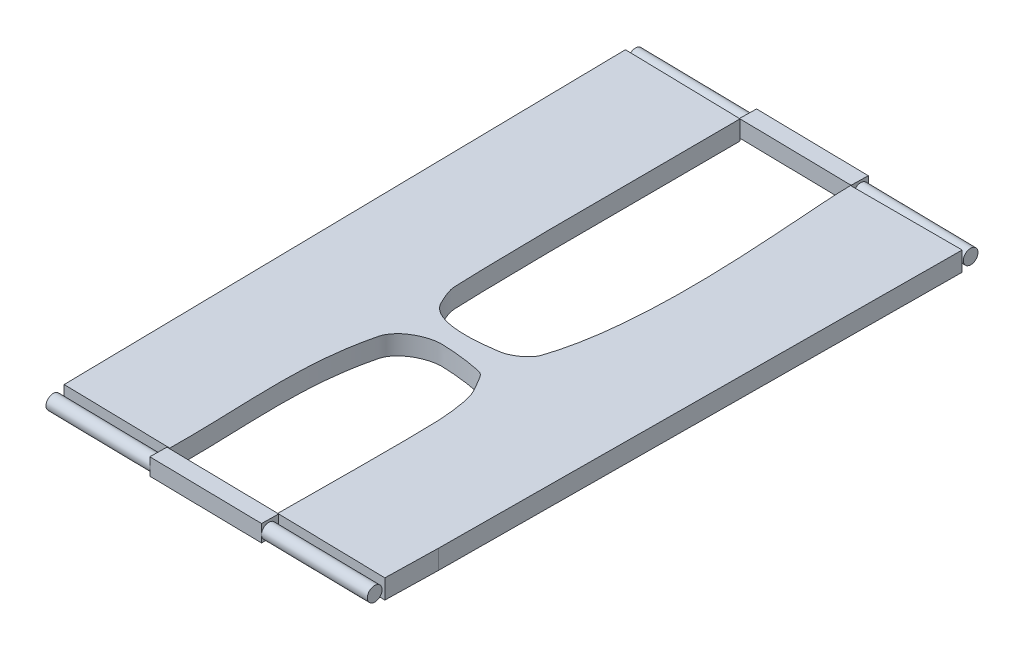
ISO-10303-21;
HEADER;
FILE_DESCRIPTION(('STEP AP214'),'2;1');
FILE_NAME('part.step','',(''),(''),'','','');
FILE_SCHEMA(('AUTOMOTIVE_DESIGN { 1 0 10303 214 1 1 1 1 }'));
ENDSEC;
DATA;
#1=APPLICATION_CONTEXT('core data for automotive mechanical design processes');
#2=APPLICATION_PROTOCOL_DEFINITION('international standard','automotive_design',2000,#1);
#3=PRODUCT_CONTEXT('',#1,'mechanical');
#4=PRODUCT('Part','Part','',(#3));
#5=PRODUCT_RELATED_PRODUCT_CATEGORY('part','',(#4));
#6=PRODUCT_DEFINITION_FORMATION('','',#4);
#7=PRODUCT_DEFINITION_CONTEXT('part definition',#1,'design');
#8=PRODUCT_DEFINITION('design','',#6,#7);
#9=PRODUCT_DEFINITION_SHAPE('','',#8);
#10=(LENGTH_UNIT() NAMED_UNIT(*) SI_UNIT(.MILLI.,.METRE.));
#11=(NAMED_UNIT(*) PLANE_ANGLE_UNIT() SI_UNIT($,.RADIAN.));
#12=(NAMED_UNIT(*) SI_UNIT($,.STERADIAN.) SOLID_ANGLE_UNIT());
#13=UNCERTAINTY_MEASURE_WITH_UNIT(LENGTH_MEASURE(1.E-05),#10,'distance_accuracy_value','');
#14=(GEOMETRIC_REPRESENTATION_CONTEXT(3) GLOBAL_UNCERTAINTY_ASSIGNED_CONTEXT((#13)) GLOBAL_UNIT_ASSIGNED_CONTEXT((#10,
#11,#12)) REPRESENTATION_CONTEXT('',''));
#15=CARTESIAN_POINT('',(0.,0.,0.));
#16=DIRECTION('',(0.,0.,1.));
#17=DIRECTION('',(1.,0.,0.));
#18=AXIS2_PLACEMENT_3D('',#15,#16,#17);
#19=CARTESIAN_POINT('',(16.938276071077,32.4664425061498,79.9782570236714));
#20=DIRECTION('',(0.999866385580923,0.,-0.0163465894100423));
#21=DIRECTION('',(-0.0163465894100423,0.,-0.999866385580923));
#22=AXIS2_PLACEMENT_3D('',#19,#20,#21);
#23=PLANE('',#22);
#24=DIRECTION('',(0.,1.,0.));
#25=VECTOR('',#24,1.);
#26=CARTESIAN_POINT('',(16.6869872427391,22.4664425061498,64.6077570236714));
#27=LINE('',#26,#25);
#28=CARTESIAN_POINT('',(16.6869872427391,31.4664425061498,64.6077570236714));
#29=VERTEX_POINT('',#28);
#30=CARTESIAN_POINT('',(16.6869872427391,32.4664425061498,64.6077570236714));
#31=VERTEX_POINT('',#30);
#32=EDGE_CURVE('P0_E214',#29,#31,#27,.T.);
#33=ORIENTED_EDGE('',*,*,#32,.T.);
#34=DIRECTION('',(0.0163465894100423,0.,0.999866385580923));
#35=VECTOR('',#34,1.);
#36=CARTESIAN_POINT('',(16.938276071077,32.4664425061498,79.9782570236714));
#37=LINE('',#36,#35);
#38=CARTESIAN_POINT('',(16.2029100181346,32.4664425061498,34.998366785361));
#39=VERTEX_POINT('',#38);
#40=EDGE_CURVE('P0_E154',#39,#31,#37,.T.);
#41=ORIENTED_EDGE('',*,*,#40,.F.);
#42=DIRECTION('',(0.,1.,0.));
#43=VECTOR('',#42,1.);
#44=CARTESIAN_POINT('',(16.2029100181346,22.4664425061498,34.998366785361));
#45=LINE('',#44,#43);
#46=CARTESIAN_POINT('',(16.2029100181346,31.4664425061498,34.998366785361));
#47=VERTEX_POINT('',#46);
#48=EDGE_CURVE('P0_E217',#47,#39,#45,.T.);
#49=ORIENTED_EDGE('',*,*,#48,.F.);
#50=DIRECTION('',(0.0163465894100423,0.,0.999866385580923));
#51=VECTOR('',#50,1.);
#52=CARTESIAN_POINT('',(16.938276071077,31.4664425061498,79.9782570236714));
#53=LINE('',#52,#51);
#54=EDGE_CURVE('P0_E275',#47,#29,#53,.T.);
#55=ORIENTED_EDGE('',*,*,#54,.T.);
#56=EDGE_LOOP('',(#33,#41,#49,#55));
#57=FACE_BOUND('',#56,.T.);
#58=ADVANCED_FACE('P0_F49',(#57),#23,.F.);
#59=CARTESIAN_POINT('',(34.015791695193,32.4664425061498,24.7044659959982));
#60=DIRECTION('',(-0.999975888217774,0.,-0.0069442770015123));
#61=DIRECTION('',(-0.00694427700151229,0.,0.999975888217774));
#62=AXIS2_PLACEMENT_3D('',#59,#60,#61);
#63=PLANE('',#62);
#64=DIRECTION('',(0.,1.,0.));
#65=VECTOR('',#64,1.);
#66=CARTESIAN_POINT('',(33.942462668181,22.4664425061498,35.2638458857188));
#67=LINE('',#66,#65);
#68=CARTESIAN_POINT('',(33.942462668181,31.4664425061498,35.2638458857188));
#69=VERTEX_POINT('',#68);
#70=CARTESIAN_POINT('',(33.942462668181,32.4664425061498,35.2638458857188));
#71=VERTEX_POINT('',#70);
#72=EDGE_CURVE('P0_E78',#69,#71,#67,.T.);
#73=ORIENTED_EDGE('',*,*,#72,.T.);
#74=DIRECTION('',(0.00694427700151229,0.,-0.999975888217774));
#75=VECTOR('',#74,1.);
#76=CARTESIAN_POINT('',(34.015791695193,32.4664425061498,24.7044659959982));
#77=LINE('',#76,#75);
#78=CARTESIAN_POINT('',(33.7550662658172,32.4664425061498,62.2489278261158));
#79=VERTEX_POINT('',#78);
#80=EDGE_CURVE('P0_E88',#79,#71,#77,.T.);
#81=ORIENTED_EDGE('',*,*,#80,.F.);
#82=DIRECTION('',(0.,-1.,0.));
#83=VECTOR('',#82,1.);
#84=CARTESIAN_POINT('',(33.7550662658172,32.4664425061498,62.2489278261158));
#85=LINE('',#84,#83);
#86=CARTESIAN_POINT('',(33.7550662658172,31.4664425061498,62.2489278261158));
#87=VERTEX_POINT('',#86);
#88=EDGE_CURVE('P0_E149',#79,#87,#85,.T.);
#89=ORIENTED_EDGE('',*,*,#88,.T.);
#90=DIRECTION('',(0.00694427700151229,0.,-0.999975888217774));
#91=VECTOR('',#90,1.);
#92=CARTESIAN_POINT('',(34.015791695193,31.4664425061498,24.7044659959982));
#93=LINE('',#92,#91);
#94=EDGE_CURVE('P0_E210',#87,#69,#93,.T.);
#95=ORIENTED_EDGE('',*,*,#94,.T.);
#96=EDGE_LOOP('',(#73,#81,#89,#95));
#97=FACE_BOUND('',#96,.T.);
#98=ADVANCED_FACE('P0_F199',(#97),#63,.F.);
#99=CARTESIAN_POINT('',(-8.90593602873058,32.4664425061498,21.706389720792));
#100=DIRECTION('',(0.,1.,0.));
#101=DIRECTION('',(0.,0.,1.));
#102=AXIS2_PLACEMENT_3D('',#99,#100,#101);
#103=PLANE('',#102);
#104=DIRECTION('',(1.,0.,0.));
#105=VECTOR('',#104,1.);
#106=CARTESIAN_POINT('',(28.1494695342371,32.4664425061498,35.2638458857188));
#107=LINE('',#106,#105);
#108=CARTESIAN_POINT('',(28.1494695342371,32.4664425061498,35.2638458857188));
#109=VERTEX_POINT('',#108);
#110=EDGE_CURVE('P0_E219',#109,#71,#107,.T.);
#111=ORIENTED_EDGE('',*,*,#110,.F.);
#112=CARTESIAN_POINT('',(22.2831473732812,32.4664425061498,35.1334831710309));
#113=CARTESIAN_POINT('',(22.3266016115105,32.4664425061498,40.0872663291714));
#114=CARTESIAN_POINT('',(22.2524903732256,32.4664425061498,45.0434764170883));
#115=CARTESIAN_POINT('',(22.4135100879691,32.4664425061498,49.9948326454524));
#116=CARTESIAN_POINT('',(22.4269092842241,32.4664425061498,50.4068579302927));
#117=CARTESIAN_POINT('',(22.6202375128934,32.4664425061498,50.7993756393648));
#118=CARTESIAN_POINT('',(22.8045982320329,32.4664425061498,51.1680970776436));
#119=CARTESIAN_POINT('',(23.3887553350724,32.4664425061498,52.3364112837227));
#120=CARTESIAN_POINT('',(25.9336122997829,32.4664425061498,51.9241513963951));
#121=CARTESIAN_POINT('',(26.5851169579822,32.4664425061498,51.8199106510832));
#122=CARTESIAN_POINT('',(26.9721703698342,32.4664425061498,51.7579821051869));
#123=CARTESIAN_POINT('',(27.6170817590701,32.4664425061498,51.3312705415775));
#124=CARTESIAN_POINT('',(27.7583813901734,32.4664425061498,50.9073716482678));
#125=CARTESIAN_POINT('',(29.340064443714,32.4664425061498,46.162322487646));
#126=CARTESIAN_POINT('',(28.1285361396691,32.4664425061498,37.6502528664753));
#127=CARTESIAN_POINT('',(28.1494695342371,32.4664425061498,35.2638458857188));
#128=B_SPLINE_CURVE_WITH_KNOTS('',3,(#112,#113,#114,#115,#116,#117,#118,#119,#120,#121,#122,
#123,#124,#125,#126,#127),.UNSPECIFIED.,.F.,.F.,(4,3,3,3,3,4),(0.,1.,2.,3.,4.,5.),.UNSPECIFIED.);
#129=CARTESIAN_POINT('',(22.2831473732812,32.4664425061498,35.1334831710309));
#130=VERTEX_POINT('',#129);
#131=EDGE_CURVE('P0_E162',#130,#109,#128,.T.);
#132=ORIENTED_EDGE('',*,*,#131,.F.);
#133=DIRECTION('',(0.99975317783161,0.,0.0222167372851469));
#134=VECTOR('',#133,1.);
#135=CARTESIAN_POINT('',(22.2831473732812,32.4664425061498,35.1334831710309));
#136=LINE('',#135,#134);
#137=EDGE_CURVE('P0_E52',#39,#130,#136,.T.);
#138=ORIENTED_EDGE('',*,*,#137,.F.);
#139=ORIENTED_EDGE('',*,*,#40,.T.);
#140=DIRECTION('',(-0.999777531834694,0.,-0.0210923407550632));
#141=VECTOR('',#140,1.);
#142=CARTESIAN_POINT('',(16.6869872427391,32.4664425061498,64.6077570236714));
#143=LINE('',#142,#141);
#144=CARTESIAN_POINT('',(22.2831473732812,32.4664425061498,64.7258194051861));
#145=VERTEX_POINT('',#144);
#146=EDGE_CURVE('P0_E221',#145,#31,#143,.T.);
#147=ORIENTED_EDGE('',*,*,#146,.F.);
#148=CARTESIAN_POINT('',(28.0191068195492,32.4664425061498,64.856182119874));
#149=CARTESIAN_POINT('',(28.0191068195492,32.4664425061498,62.1620193496572));
#150=CARTESIAN_POINT('',(28.0881652183083,32.4664425061498,59.4669713608293));
#151=CARTESIAN_POINT('',(28.0191068195492,32.4664425061498,56.7736938092237));
#152=CARTESIAN_POINT('',(28.0011466063079,32.4664425061498,56.0732454928124));
#153=CARTESIAN_POINT('',(27.9283208972691,32.4664425061498,55.3676484026002));
#154=CARTESIAN_POINT('',(27.7583813901734,32.4664425061498,54.6878903742172));
#155=CARTESIAN_POINT('',(27.6641159122409,32.4664425061498,54.3108284624874));
#156=CARTESIAN_POINT('',(27.425683680594,32.4664425061498,53.9847443252239));
#157=CARTESIAN_POINT('',(27.2369305314217,32.4664425061498,53.6449886567139));
#158=CARTESIAN_POINT('',(27.1473970513847,32.4664425061498,53.4838283926472));
#159=CARTESIAN_POINT('',(27.0258129357881,32.4664425061498,53.2938939678568));
#160=CARTESIAN_POINT('',(26.845842387358,32.4664425061498,53.2539005126502));
#161=CARTESIAN_POINT('',(26.1618490654859,32.4664425061498,53.1019019966786));
#162=CARTESIAN_POINT('',(25.4599244184686,32.4664425061498,53.0265029626132));
#163=CARTESIAN_POINT('',(24.7600389523515,32.4664425061498,52.9931750832743));
#164=CARTESIAN_POINT('',(23.9778611730803,32.4664425061498,52.9559285223567));
#165=CARTESIAN_POINT('',(22.8727461156141,32.4664425061498,53.5027598370769));
#166=CARTESIAN_POINT('',(22.6742355173449,32.4664425061498,54.2968022301534));
#167=CARTESIAN_POINT('',(21.8296140700593,32.4664425061498,57.6752880192961));
#168=CARTESIAN_POINT('',(22.3373894888024,32.4664425061498,60.8203870876585));
#169=CARTESIAN_POINT('',(22.2831473732812,32.4664425061498,64.7258194051861));
#170=B_SPLINE_CURVE_WITH_KNOTS('',3,(#148,#149,#150,#151,#152,#153,#154,#155,#156,#157,#158,
#159,#160,#161,#162,#163,#164,#165,#166,#167,#168,#169),.UNSPECIFIED.,.F.,.F.,(4,3,3,3,3,3,3,4),
(0.,1.,2.,3.,4.,5.,6.,7.),.UNSPECIFIED.);
#171=CARTESIAN_POINT('',(28.0191068195492,32.4664425061498,64.856182119874));
#172=VERTEX_POINT('',#171);
#173=EDGE_CURVE('P0_E143',#172,#145,#170,.T.);
#174=ORIENTED_EDGE('',*,*,#173,.F.);
#175=DIRECTION('',(-0.999777385803806,0.,-0.0210992614872563));
#176=VECTOR('',#175,1.);
#177=CARTESIAN_POINT('',(28.0191068195492,32.4664425061498,64.856182119874));
#178=LINE('',#177,#176);
#179=CARTESIAN_POINT('',(33.6957824695795,32.4664425061498,64.9759824530472));
#180=VERTEX_POINT('',#179);
#181=EDGE_CURVE('P0_E127',#180,#172,#178,.T.);
#182=ORIENTED_EDGE('',*,*,#181,.F.);
#183=DIRECTION('',(0.0217339954092151,0.,-0.999763788823916));
#184=VECTOR('',#183,1.);
#185=CARTESIAN_POINT('',(33.7550662658172,32.4664425061498,62.2489278261158));
#186=LINE('',#185,#184);
#187=EDGE_CURVE('P0_E139',#180,#79,#186,.T.);
#188=ORIENTED_EDGE('',*,*,#187,.T.);
#189=ORIENTED_EDGE('',*,*,#80,.T.);
#190=EDGE_LOOP('',(#111,#132,#138,#139,#147,#174,#182,#188,#189));
#191=FACE_BOUND('',#190,.T.);
#192=ADVANCED_FACE('P0_F138',(#191),#103,.T.);
#193=CARTESIAN_POINT('',(-8.90593602873058,31.4664425061498,21.706389720792));
#194=DIRECTION('',(0.,1.,0.));
#195=DIRECTION('',(0.,0.,1.));
#196=AXIS2_PLACEMENT_3D('',#193,#194,#195);
#197=PLANE('',#196);
#198=CARTESIAN_POINT('',(22.2831473732812,31.4664425061498,35.1334831710309));
#199=CARTESIAN_POINT('',(22.3266016115105,31.4664425061498,40.0872663291714));
#200=CARTESIAN_POINT('',(22.2524903732256,31.4664425061498,45.0434764170883));
#201=CARTESIAN_POINT('',(22.4135100879691,31.4664425061498,49.9948326454524));
#202=CARTESIAN_POINT('',(22.4269092842241,31.4664425061498,50.4068579302927));
#203=CARTESIAN_POINT('',(22.6202375128934,31.4664425061498,50.7993756393648));
#204=CARTESIAN_POINT('',(22.8045982320329,31.4664425061498,51.1680970776436));
#205=CARTESIAN_POINT('',(23.3887553350724,31.4664425061498,52.3364112837227));
#206=CARTESIAN_POINT('',(25.9336122997829,31.4664425061498,51.9241513963951));
#207=CARTESIAN_POINT('',(26.5851169579822,31.4664425061498,51.8199106510832));
#208=CARTESIAN_POINT('',(26.9721703698342,31.4664425061498,51.7579821051869));
#209=CARTESIAN_POINT('',(27.6170817590701,31.4664425061498,51.3312705415775));
#210=CARTESIAN_POINT('',(27.7583813901734,31.4664425061498,50.9073716482678));
#211=CARTESIAN_POINT('',(29.340064443714,31.4664425061498,46.162322487646));
#212=CARTESIAN_POINT('',(28.1285361396691,31.4664425061498,37.6502528664753));
#213=CARTESIAN_POINT('',(28.1494695342371,31.4664425061498,35.2638458857188));
#214=B_SPLINE_CURVE_WITH_KNOTS('',3,(#198,#199,#200,#201,#202,#203,#204,#205,#206,#207,#208,
#209,#210,#211,#212,#213),.UNSPECIFIED.,.F.,.F.,(4,3,3,3,3,4),(0.,1.,2.,3.,4.,5.),.UNSPECIFIED.);
#215=CARTESIAN_POINT('',(22.2831473732812,31.4664425061498,35.1334831710309));
#216=VERTEX_POINT('',#215);
#217=CARTESIAN_POINT('',(28.1494695342371,31.4664425061498,35.2638458857188));
#218=VERTEX_POINT('',#217);
#219=EDGE_CURVE('P0_E160',#216,#218,#214,.T.);
#220=ORIENTED_EDGE('',*,*,#219,.T.);
#221=DIRECTION('',(1.,0.,0.));
#222=VECTOR('',#221,1.);
#223=CARTESIAN_POINT('',(-8.90593602873058,31.4664425061498,35.2638458857188));
#224=LINE('',#223,#222);
#225=EDGE_CURVE('P0_E237',#218,#69,#224,.T.);
#226=ORIENTED_EDGE('',*,*,#225,.T.);
#227=ORIENTED_EDGE('',*,*,#94,.F.);
#228=DIRECTION('',(0.0217339954092151,0.,-0.999763788823916));
#229=VECTOR('',#228,1.);
#230=CARTESIAN_POINT('',(33.7550662658172,31.4664425061498,62.2489278261158));
#231=LINE('',#230,#229);
#232=CARTESIAN_POINT('',(33.6957824695795,31.4664425061498,64.9759824530472));
#233=VERTEX_POINT('',#232);
#234=EDGE_CURVE('P0_E169',#233,#87,#231,.T.);
#235=ORIENTED_EDGE('',*,*,#234,.F.);
#236=DIRECTION('',(-0.999777385803806,0.,-0.0210992614872563));
#237=VECTOR('',#236,1.);
#238=CARTESIAN_POINT('',(-9.79972385974573,31.4664425061498,64.0580550478127));
#239=LINE('',#238,#237);
#240=CARTESIAN_POINT('',(28.0191068195492,31.4664425061498,64.856182119874));
#241=VERTEX_POINT('',#240);
#242=EDGE_CURVE('P0_E130',#233,#241,#239,.T.);
#243=ORIENTED_EDGE('',*,*,#242,.T.);
#244=CARTESIAN_POINT('',(28.0191068195492,31.4664425061498,64.856182119874));
#245=CARTESIAN_POINT('',(28.0191068195492,31.4664425061498,62.1620193496572));
#246=CARTESIAN_POINT('',(28.0881652183083,31.4664425061498,59.4669713608293));
#247=CARTESIAN_POINT('',(28.0191068195492,31.4664425061498,56.7736938092237));
#248=CARTESIAN_POINT('',(28.0011466063079,31.4664425061498,56.0732454928124));
#249=CARTESIAN_POINT('',(27.9283208972691,31.4664425061498,55.3676484026002));
#250=CARTESIAN_POINT('',(27.7583813901734,31.4664425061498,54.6878903742172));
#251=CARTESIAN_POINT('',(27.6641159122409,31.4664425061498,54.3108284624874));
#252=CARTESIAN_POINT('',(27.425683680594,31.4664425061498,53.9847443252239));
#253=CARTESIAN_POINT('',(27.2369305314217,31.4664425061498,53.6449886567139));
#254=CARTESIAN_POINT('',(27.1473970513847,31.4664425061498,53.4838283926472));
#255=CARTESIAN_POINT('',(27.0258129357881,31.4664425061498,53.2938939678568));
#256=CARTESIAN_POINT('',(26.845842387358,31.4664425061498,53.2539005126502));
#257=CARTESIAN_POINT('',(26.1618490654859,31.4664425061498,53.1019019966786));
#258=CARTESIAN_POINT('',(25.4599244184686,31.4664425061498,53.0265029626132));
#259=CARTESIAN_POINT('',(24.7600389523515,31.4664425061498,52.9931750832743));
#260=CARTESIAN_POINT('',(23.9778611730803,31.4664425061498,52.9559285223567));
#261=CARTESIAN_POINT('',(22.8727461156141,31.4664425061498,53.5027598370769));
#262=CARTESIAN_POINT('',(22.6742355173449,31.4664425061498,54.2968022301534));
#263=CARTESIAN_POINT('',(21.8296140700593,31.4664425061498,57.6752880192961));
#264=CARTESIAN_POINT('',(22.3373894888024,31.4664425061498,60.8203870876585));
#265=CARTESIAN_POINT('',(22.2831473732812,31.4664425061498,64.7258194051861));
#266=B_SPLINE_CURVE_WITH_KNOTS('',3,(#244,#245,#246,#247,#248,#249,#250,#251,#252,#253,#254,
#255,#256,#257,#258,#259,#260,#261,#262,#263,#264,#265),.UNSPECIFIED.,.F.,.F.,(4,3,3,3,3,3,3,4),
(0.,1.,2.,3.,4.,5.,6.,7.),.UNSPECIFIED.);
#267=CARTESIAN_POINT('',(22.2831473732812,31.4664425061498,64.7258194051861));
#268=VERTEX_POINT('',#267);
#269=EDGE_CURVE('P0_E243',#241,#268,#266,.T.);
#270=ORIENTED_EDGE('',*,*,#269,.T.);
#271=DIRECTION('',(-0.999777531834694,0.,-0.0210923407550632));
#272=VECTOR('',#271,1.);
#273=CARTESIAN_POINT('',(-9.79923902274261,31.4664425061498,64.0489762030202));
#274=LINE('',#273,#272);
#275=EDGE_CURVE('P0_E235',#268,#29,#274,.T.);
#276=ORIENTED_EDGE('',*,*,#275,.T.);
#277=ORIENTED_EDGE('',*,*,#54,.F.);
#278=DIRECTION('',(0.99975317783161,0.,0.0222167372851469));
#279=VECTOR('',#278,1.);
#280=CARTESIAN_POINT('',(-9.18877419351772,31.4664425061498,34.4341071362131));
#281=LINE('',#280,#279);
#282=EDGE_CURVE('P0_E66',#47,#216,#281,.T.);
#283=ORIENTED_EDGE('',*,*,#282,.T.);
#284=EDGE_LOOP('',(#220,#226,#227,#235,#243,#270,#276,#277,#283));
#285=FACE_BOUND('',#284,.T.);
#286=ADVANCED_FACE('P0_F206',(#285),#197,.F.);
#287=CARTESIAN_POINT('',(33.7550662658172,32.4664425061498,62.2489278261158));
#288=DIRECTION('',(-0.999763788823916,0.,-0.0217339954092151));
#289=DIRECTION('',(-0.0217339954092151,0.,0.999763788823916));
#290=AXIS2_PLACEMENT_3D('',#287,#288,#289);
#291=PLANE('',#290);
#292=ORIENTED_EDGE('',*,*,#187,.F.);
#293=DIRECTION('',(0.,1.,0.));
#294=VECTOR('',#293,1.);
#295=CARTESIAN_POINT('',(33.6957824695795,22.4664425061498,64.9759824530472));
#296=LINE('',#295,#294);
#297=EDGE_CURVE('P0_E124',#233,#180,#296,.T.);
#298=ORIENTED_EDGE('',*,*,#297,.F.);
#299=ORIENTED_EDGE('',*,*,#234,.T.);
#300=ORIENTED_EDGE('',*,*,#88,.F.);
#301=EDGE_LOOP('',(#292,#298,#299,#300));
#302=FACE_BOUND('',#301,.T.);
#303=ADVANCED_FACE('P0_F147',(#302),#291,.F.);
#304=DIRECTION('',(0.,-1.,0.));
#305=VECTOR('',#304,1.);
#306=SURFACE_OF_LINEAR_EXTRUSION('',#128,#305);
#307=ORIENTED_EDGE('',*,*,#219,.F.);
#308=DIRECTION('',(0.,-1.,0.));
#309=VECTOR('',#308,1.);
#310=CARTESIAN_POINT('',(22.2831473732812,32.4664425061498,35.1334831710309));
#311=LINE('',#310,#309);
#312=EDGE_CURVE('P0_E12',#130,#216,#311,.T.);
#313=ORIENTED_EDGE('',*,*,#312,.F.);
#314=ORIENTED_EDGE('',*,*,#131,.T.);
#315=DIRECTION('',(0.,-1.,0.));
#316=VECTOR('',#315,1.);
#317=CARTESIAN_POINT('',(28.1494695342371,32.4664425061498,35.2638458857188));
#318=LINE('',#317,#316);
#319=EDGE_CURVE('P0_E168',#109,#218,#318,.T.);
#320=ORIENTED_EDGE('',*,*,#319,.T.);
#321=EDGE_LOOP('',(#307,#313,#314,#320));
#322=FACE_BOUND('',#321,.T.);
#323=ADVANCED_FACE('P0_F178',(#322),#306,.T.);
#324=DIRECTION('',(0.,-1.,0.));
#325=VECTOR('',#324,1.);
#326=SURFACE_OF_LINEAR_EXTRUSION('',#170,#325);
#327=ORIENTED_EDGE('',*,*,#269,.F.);
#328=DIRECTION('',(0.,-1.,0.));
#329=VECTOR('',#328,1.);
#330=CARTESIAN_POINT('',(28.0191068195492,32.4664425061498,64.856182119874));
#331=LINE('',#330,#329);
#332=EDGE_CURVE('P0_E145',#172,#241,#331,.T.);
#333=ORIENTED_EDGE('',*,*,#332,.F.);
#334=ORIENTED_EDGE('',*,*,#173,.T.);
#335=DIRECTION('',(0.,-1.,0.));
#336=VECTOR('',#335,1.);
#337=CARTESIAN_POINT('',(22.2831473732812,32.4664425061498,64.7258194051861));
#338=LINE('',#337,#336);
#339=EDGE_CURVE('P0_E135',#145,#268,#338,.T.);
#340=ORIENTED_EDGE('',*,*,#339,.T.);
#341=EDGE_LOOP('',(#327,#333,#334,#340));
#342=FACE_BOUND('',#341,.T.);
#343=ADVANCED_FACE('P0_F182',(#342),#326,.T.);
#344=CARTESIAN_POINT('',(28.0191068195492,22.4664425061498,64.856182119874));
#345=DIRECTION('',(0.0210992614872563,0.,-0.999777385803806));
#346=DIRECTION('',(-0.999777385803806,0.,-0.0210992614872563));
#347=AXIS2_PLACEMENT_3D('',#344,#345,#346);
#348=PLANE('',#347);
#349=ORIENTED_EDGE('',*,*,#297,.T.);
#350=ORIENTED_EDGE('',*,*,#181,.T.);
#351=ORIENTED_EDGE('',*,*,#332,.T.);
#352=ORIENTED_EDGE('',*,*,#242,.F.);
#353=EDGE_LOOP('',(#349,#350,#351,#352));
#354=FACE_BOUND('',#353,.T.);
#355=ADVANCED_FACE('P0_F126',(#354),#348,.F.);
#356=CARTESIAN_POINT('',(16.6869872427391,22.4664425061498,64.6077570236714));
#357=DIRECTION('',(0.0210923407550632,0.,-0.999777531834694));
#358=DIRECTION('',(-0.999777531834694,0.,-0.0210923407550632));
#359=AXIS2_PLACEMENT_3D('',#356,#357,#358);
#360=PLANE('',#359);
#361=ORIENTED_EDGE('',*,*,#339,.F.);
#362=ORIENTED_EDGE('',*,*,#146,.T.);
#363=ORIENTED_EDGE('',*,*,#32,.F.);
#364=ORIENTED_EDGE('',*,*,#275,.F.);
#365=EDGE_LOOP('',(#361,#362,#363,#364));
#366=FACE_BOUND('',#365,.T.);
#367=ADVANCED_FACE('P0_F190',(#366),#360,.F.);
#368=CARTESIAN_POINT('',(28.1494695342371,22.4664425061498,35.2638458857188));
#369=DIRECTION('',(0.,0.,1.));
#370=DIRECTION('',(1.,0.,0.));
#371=AXIS2_PLACEMENT_3D('',#368,#369,#370);
#372=PLANE('',#371);
#373=ORIENTED_EDGE('',*,*,#319,.F.);
#374=ORIENTED_EDGE('',*,*,#110,.T.);
#375=ORIENTED_EDGE('',*,*,#72,.F.);
#376=ORIENTED_EDGE('',*,*,#225,.F.);
#377=EDGE_LOOP('',(#373,#374,#375,#376));
#378=FACE_BOUND('',#377,.T.);
#379=ADVANCED_FACE('P0_F193',(#378),#372,.F.);
#380=CARTESIAN_POINT('',(22.2831473732812,22.4664425061498,35.1334831710309));
#381=DIRECTION('',(-0.0222167372851469,0.,0.99975317783161));
#382=DIRECTION('',(0.99975317783161,0.,0.0222167372851469));
#383=AXIS2_PLACEMENT_3D('',#380,#381,#382);
#384=PLANE('',#383);
#385=ORIENTED_EDGE('',*,*,#48,.T.);
#386=ORIENTED_EDGE('',*,*,#137,.T.);
#387=ORIENTED_EDGE('',*,*,#312,.T.);
#388=ORIENTED_EDGE('',*,*,#282,.F.);
#389=EDGE_LOOP('',(#385,#386,#387,#388));
#390=FACE_BOUND('',#389,.T.);
#391=ADVANCED_FACE('P0_F195',(#390),#384,.F.);
#392=CLOSED_SHELL('',(#58,#98,#192,#286,#303,#323,#343,#355,#367,#379,#391));
#393=MANIFOLD_SOLID_BREP('P0_B2',#392);
#394=CARTESIAN_POINT('',(34.1583279861381,31.9664425061498,34.8409039792696));
#395=DIRECTION('',(-0.999847695156391,0.,-0.0174524064372702));
#396=DIRECTION('',(0.,-1.,0.));
#397=AXIS2_PLACEMENT_3D('',#394,#395,#396);
#398=CYLINDRICAL_SURFACE('',#397,0.375);
#399=CARTESIAN_POINT('',(28.1592418151998,31.9664425061498,34.736189540646));
#400=DIRECTION('',(0.999847695156391,0.,0.0174524064372702));
#401=DIRECTION('',(0.,1.,0.));
#402=AXIS2_PLACEMENT_3D('',#399,#400,#401);
#403=CIRCLE('',#402,0.375);
#404=CARTESIAN_POINT('',(28.1592418151998,32.3414425061498,34.736189540646));
#405=VERTEX_POINT('',#404);
#406=EDGE_CURVE('P0_E48',#405,#405,#403,.T.);
#407=ORIENTED_EDGE('',*,*,#406,.T.);
#408=EDGE_LOOP('',(#407));
#409=FACE_BOUND('',#408,.T.);
#410=CARTESIAN_POINT('',(33.9551589344824,31.9664425061498,34.8373576502816));
#411=DIRECTION('',(0.99984769515639,0.,0.017452406437378));
#412=DIRECTION('',(0.017452406437378,0.,-0.99984769515639));
#413=AXIS2_PLACEMENT_3D('',#410,#411,#412);
#414=CIRCLE('',#413,0.375);
#415=CARTESIAN_POINT('',(33.9617035868964,31.9664425061498,34.462414764598));
#416=VERTEX_POINT('',#415);
#417=EDGE_CURVE('P0_E381',#416,#416,#414,.T.);
#418=ORIENTED_EDGE('',*,*,#417,.F.);
#419=EDGE_LOOP('',(#418));
#420=FACE_BOUND('',#419,.T.);
#421=ADVANCED_FACE('P0_F378',(#409,#420),#398,.T.);
#422=CARTESIAN_POINT('',(28.1592418151998,31.9664425061498,34.736189540646));
#423=DIRECTION('',(0.999847695156391,0.,0.0174524064372702));
#424=DIRECTION('',(0.,1.,0.));
#425=AXIS2_PLACEMENT_3D('',#422,#423,#424);
#426=PLANE('',#425);
#427=ORIENTED_EDGE('',*,*,#406,.F.);
#428=EDGE_LOOP('',(#427));
#429=FACE_BOUND('',#428,.T.);
#430=ADVANCED_FACE('P0_F393',(#429),#426,.F.);
#431=CARTESIAN_POINT('',(34.5527197760127,-1.96213699297756E-13,0.603119967140098));
#432=DIRECTION('',(0.99984769515639,0.,0.017452406437378));
#433=DIRECTION('',(0.017452406437378,0.,-0.99984769515639));
#434=AXIS2_PLACEMENT_3D('',#431,#432,#433);
#435=PLANE('',#434);
#436=ORIENTED_EDGE('',*,*,#417,.T.);
#437=EDGE_LOOP('',(#436));
#438=FACE_BOUND('',#437,.T.);
#439=ADVANCED_FACE('P0_F390',(#438),#435,.T.);
#440=CLOSED_SHELL('',(#421,#430,#439));
#441=MANIFOLD_SOLID_BREP('P0_B6',#440);
#442=CARTESIAN_POINT('',(22.1621342748397,31.9664425061498,65.2556019853949));
#443=DIRECTION('',(-0.999849087904556,0.,-0.0173724326571371));
#444=DIRECTION('',(0.017372432657137,0.,-0.999849087904556));
#445=AXIS2_PLACEMENT_3D('',#442,#443,#444);
#446=CYLINDRICAL_SURFACE('',#445,0.375);
#447=CARTESIAN_POINT('',(22.1621342748397,31.9664425061498,65.2556019853949));
#448=DIRECTION('',(0.999849087904556,0.,0.0173724326571371));
#449=DIRECTION('',(-0.017372432657137,0.,0.999849087904556));
#450=AXIS2_PLACEMENT_3D('',#447,#448,#449);
#451=CIRCLE('',#450,0.375);
#452=CARTESIAN_POINT('',(22.1556196125933,31.9664425061498,65.6305453933591));
#453=VERTEX_POINT('',#452);
#454=EDGE_CURVE('P0_E377',#453,#453,#451,.T.);
#455=ORIENTED_EDGE('',*,*,#454,.F.);
#456=EDGE_LOOP('',(#455));
#457=FACE_BOUND('',#456,.T.);
#458=CARTESIAN_POINT('',(16.6792618314975,31.9664425061498,65.160336776433));
#459=DIRECTION('',(-0.999849087904556,0.,-0.0173724326571369));
#460=DIRECTION('',(-0.0173724326571369,0.,0.999849087904557));
#461=AXIS2_PLACEMENT_3D('',#458,#459,#460);
#462=CIRCLE('',#461,0.375);
#463=CARTESIAN_POINT('',(16.6727471692511,31.9664425061498,65.5352801843972));
#464=VERTEX_POINT('',#463);
#465=EDGE_CURVE('P0_E432',#464,#464,#462,.T.);
#466=ORIENTED_EDGE('',*,*,#465,.F.);
#467=EDGE_LOOP('',(#466));
#468=FACE_BOUND('',#467,.T.);
#469=ADVANCED_FACE('P0_F429',(#457,#468),#446,.T.);
#470=CARTESIAN_POINT('',(22.1621342748397,31.9664425061498,65.2556019853949));
#471=DIRECTION('',(0.999849087904556,0.,0.0173724326571371));
#472=DIRECTION('',(-0.017372432657137,0.,0.999849087904556));
#473=AXIS2_PLACEMENT_3D('',#470,#471,#472);
#474=PLANE('',#473);
#475=ORIENTED_EDGE('',*,*,#454,.T.);
#476=EDGE_LOOP('',(#475));
#477=FACE_BOUND('',#476,.T.);
#478=ADVANCED_FACE('P0_F444',(#477),#474,.T.);
#479=CARTESIAN_POINT('',(17.8060507376962,0.,0.309381106681291));
#480=DIRECTION('',(-0.999849087904556,0.,-0.0173724326571369));
#481=DIRECTION('',(-0.0173724326571369,0.,0.999849087904557));
#482=AXIS2_PLACEMENT_3D('',#479,#480,#481);
#483=PLANE('',#482);
#484=ORIENTED_EDGE('',*,*,#465,.T.);
#485=EDGE_LOOP('',(#484));
#486=FACE_BOUND('',#485,.T.);
#487=ADVANCED_FACE('P0_F441',(#486),#483,.T.);
#488=CLOSED_SHELL('',(#469,#478,#487));
#489=MANIFOLD_SOLID_BREP('P0_B43',#488);
#490=CARTESIAN_POINT('',(34.060338420904,31.9664425061498,65.4623339340149));
#491=DIRECTION('',(-0.999849087904556,0.,-0.0173724326571371));
#492=DIRECTION('',(-0.017372432657137,0.,0.999849087904556));
#493=AXIS2_PLACEMENT_3D('',#490,#491,#492);
#494=CYLINDRICAL_SURFACE('',#493,0.375);
#495=CARTESIAN_POINT('',(28.0612438934766,31.9664425061498,65.358099338072));
#496=DIRECTION('',(0.999849087904556,0.,0.0173724326571371));
#497=DIRECTION('',(0.017372432657137,0.,-0.999849087904556));
#498=AXIS2_PLACEMENT_3D('',#495,#496,#497);
#499=CIRCLE('',#498,0.375);
#500=CARTESIAN_POINT('',(28.0677585557231,31.9664425061498,64.9831559301078));
#501=VERTEX_POINT('',#500);
#502=EDGE_CURVE('P0_E428',#501,#501,#499,.T.);
#503=ORIENTED_EDGE('',*,*,#502,.T.);
#504=EDGE_LOOP('',(#503));
#505=FACE_BOUND('',#504,.T.);
#506=CARTESIAN_POINT('',(33.6486564402332,31.9664425061498,65.4551809370557));
#507=DIRECTION('',(0.999763788823916,0.,0.0217339954092237));
#508=DIRECTION('',(-0.0217339954092237,0.,0.999763788823916));
#509=AXIS2_PLACEMENT_3D('',#506,#507,#508);
#510=ELLIPSE('',#509,0.375003568253748,0.375);
#511=CARTESIAN_POINT('',(33.6405061144023,31.9664425061498,65.8300959252756));
#512=VERTEX_POINT('',#511);
#513=EDGE_CURVE('P0_E476',#512,#512,#510,.T.);
#514=ORIENTED_EDGE('',*,*,#513,.F.);
#515=EDGE_LOOP('',(#514));
#516=FACE_BOUND('',#515,.T.);
#517=ADVANCED_FACE('P0_F473',(#505,#516),#494,.T.);
#518=CARTESIAN_POINT('',(28.0612438934766,31.9664425061498,65.358099338072));
#519=DIRECTION('',(0.999849087904556,0.,0.0173724326571371));
#520=DIRECTION('',(0.017372432657137,0.,-0.999849087904556));
#521=AXIS2_PLACEMENT_3D('',#518,#519,#520);
#522=PLANE('',#521);
#523=ORIENTED_EDGE('',*,*,#502,.F.);
#524=EDGE_LOOP('',(#523));
#525=FACE_BOUND('',#524,.T.);
#526=ADVANCED_FACE('P0_F488',(#525),#522,.F.);
#527=CARTESIAN_POINT('',(35.0550285076236,0.,0.762065837122538));
#528=DIRECTION('',(0.999763788823916,0.,0.0217339954092237));
#529=DIRECTION('',(0.0217339954092237,0.,-0.999763788823916));
#530=AXIS2_PLACEMENT_3D('',#527,#528,#529);
#531=PLANE('',#530);
#532=ORIENTED_EDGE('',*,*,#513,.T.);
#533=EDGE_LOOP('',(#532));
#534=FACE_BOUND('',#533,.T.);
#535=ADVANCED_FACE('P0_F485',(#534),#531,.T.);
#536=CLOSED_SHELL('',(#517,#526,#535));
#537=MANIFOLD_SOLID_BREP('P0_B372',#536);
#538=CARTESIAN_POINT('',(22.2514142105584,32.4664425061498,35.1331441902443));
#539=DIRECTION('',(0.999847695156391,0.,0.0174524064372702));
#540=DIRECTION('',(0.,1.,0.));
#541=AXIS2_PLACEMENT_3D('',#538,#539,#540);
#542=PLANE('',#541);
#543=DIRECTION('',(0.,-1.,0.));
#544=VECTOR('',#543,1.);
#545=CARTESIAN_POINT('',(22.266685066191,32.4664425061498,34.2582774569825));
#546=LINE('',#545,#544);
#547=CARTESIAN_POINT('',(22.266685066191,32.4664425061498,34.2582774569825));
#548=VERTEX_POINT('',#547);
#549=CARTESIAN_POINT('',(22.266685066191,31.5914425061498,34.2582774569825));
#550=VERTEX_POINT('',#549);
#551=EDGE_CURVE('P1_E79',#548,#550,#546,.T.);
#552=ORIENTED_EDGE('',*,*,#551,.T.);
#553=DIRECTION('',(0.0174524064372702,0.,-0.999847695156391));
#554=VECTOR('',#553,1.);
#555=CARTESIAN_POINT('',(22.2514142105584,31.5914425061498,35.1331441902443));
#556=LINE('',#555,#554);
#557=CARTESIAN_POINT('',(22.2514142105584,31.5914425061498,35.1331441902443));
#558=VERTEX_POINT('',#557);
#559=EDGE_CURVE('P1_E11',#558,#550,#556,.T.);
#560=ORIENTED_EDGE('',*,*,#559,.F.);
#561=DIRECTION('',(0.,-1.,0.));
#562=VECTOR('',#561,1.);
#563=CARTESIAN_POINT('',(22.2514142105584,32.4664425061498,35.1331441902443));
#564=LINE('',#563,#562);
#565=CARTESIAN_POINT('',(22.2514142105584,32.4664425061498,35.1331441902443));
#566=VERTEX_POINT('',#565);
#567=EDGE_CURVE('P1_E67',#566,#558,#564,.T.);
#568=ORIENTED_EDGE('',*,*,#567,.F.);
#569=DIRECTION('',(0.0174524064372702,0.,-0.999847695156391));
#570=VECTOR('',#569,1.);
#571=CARTESIAN_POINT('',(22.2514142105584,32.4664425061498,35.1331441902443));
#572=LINE('',#571,#570);
#573=EDGE_CURVE('P1_E75',#566,#548,#572,.T.);
#574=ORIENTED_EDGE('',*,*,#573,.T.);
#575=EDGE_LOOP('',(#552,#560,#568,#574));
#576=FACE_BOUND('',#575,.T.);
#577=ADVANCED_FACE('P1_F16',(#576),#542,.F.);
#578=CARTESIAN_POINT('',(22.2514142105584,31.5914425061498,35.1331441902443));
#579=DIRECTION('',(0.,1.,0.));
#580=DIRECTION('',(-0.999847695156391,0.,-0.0174524064372702));
#581=AXIS2_PLACEMENT_3D('',#578,#579,#580);
#582=PLANE('',#581);
#583=DIRECTION('',(0.999847695156391,0.,0.0174524064372702));
#584=VECTOR('',#583,1.);
#585=CARTESIAN_POINT('',(22.266685066191,31.5914425061498,34.2582774569825));
#586=LINE('',#585,#584);
#587=CARTESIAN_POINT('',(28.1657864676137,31.5914425061498,34.3612466549624));
#588=VERTEX_POINT('',#587);
#589=EDGE_CURVE('P1_E71',#550,#588,#586,.T.);
#590=ORIENTED_EDGE('',*,*,#589,.T.);
#591=DIRECTION('',(0.0174524064372702,0.,-0.999847695156391));
#592=VECTOR('',#591,1.);
#593=CARTESIAN_POINT('',(28.1505156119811,31.5914425061498,35.2361133882242));
#594=LINE('',#593,#592);
#595=CARTESIAN_POINT('',(28.1505156119811,31.5914425061498,35.2361133882242));
#596=VERTEX_POINT('',#595);
#597=EDGE_CURVE('P1_E24',#596,#588,#594,.T.);
#598=ORIENTED_EDGE('',*,*,#597,.F.);
#599=DIRECTION('',(0.999847695156391,0.,0.0174524064372702));
#600=VECTOR('',#599,1.);
#601=CARTESIAN_POINT('',(22.2514142105584,31.5914425061498,35.1331441902443));
#602=LINE('',#601,#600);
#603=EDGE_CURVE('P1_E62',#558,#596,#602,.T.);
#604=ORIENTED_EDGE('',*,*,#603,.F.);
#605=ORIENTED_EDGE('',*,*,#559,.T.);
#606=EDGE_LOOP('',(#590,#598,#604,#605));
#607=FACE_BOUND('',#606,.T.);
#608=ADVANCED_FACE('P1_F70',(#607),#582,.F.);
#609=CARTESIAN_POINT('',(28.1505156119811,32.4664425061498,35.2361133882242));
#610=DIRECTION('',(-0.999847695156391,0.,-0.0174524064372702));
#611=DIRECTION('',(0.,-1.,0.));
#612=AXIS2_PLACEMENT_3D('',#609,#610,#611);
#613=PLANE('',#612);
#614=DIRECTION('',(0.,1.,0.));
#615=VECTOR('',#614,1.);
#616=CARTESIAN_POINT('',(28.1657864676137,32.4664425061498,34.3612466549624));
#617=LINE('',#616,#615);
#618=CARTESIAN_POINT('',(28.1657864676137,32.4664425061498,34.3612466549624));
#619=VERTEX_POINT('',#618);
#620=EDGE_CURVE('P1_E49',#588,#619,#617,.T.);
#621=ORIENTED_EDGE('',*,*,#620,.T.);
#622=DIRECTION('',(0.0174524064372702,0.,-0.999847695156391));
#623=VECTOR('',#622,1.);
#624=CARTESIAN_POINT('',(28.1505156119811,32.4664425061498,35.2361133882242));
#625=LINE('',#624,#623);
#626=CARTESIAN_POINT('',(28.1505156119811,32.4664425061498,35.2361133882242));
#627=VERTEX_POINT('',#626);
#628=EDGE_CURVE('P1_E72',#627,#619,#625,.T.);
#629=ORIENTED_EDGE('',*,*,#628,.F.);
#630=DIRECTION('',(0.,1.,0.));
#631=VECTOR('',#630,1.);
#632=CARTESIAN_POINT('',(28.1505156119811,32.4664425061498,35.2361133882242));
#633=LINE('',#632,#631);
#634=EDGE_CURVE('P1_E65',#596,#627,#633,.T.);
#635=ORIENTED_EDGE('',*,*,#634,.F.);
#636=ORIENTED_EDGE('',*,*,#597,.T.);
#637=EDGE_LOOP('',(#621,#629,#635,#636));
#638=FACE_BOUND('',#637,.T.);
#639=ADVANCED_FACE('P1_F73',(#638),#613,.F.);
#640=CARTESIAN_POINT('',(22.2514142105584,32.4664425061498,35.1331441902443));
#641=DIRECTION('',(0.,-1.,0.));
#642=DIRECTION('',(0.999847695156391,0.,0.0174524064372702));
#643=AXIS2_PLACEMENT_3D('',#640,#641,#642);
#644=PLANE('',#643);
#645=DIRECTION('',(-0.999847695156391,0.,-0.0174524064372702));
#646=VECTOR('',#645,1.);
#647=CARTESIAN_POINT('',(22.266685066191,32.4664425061498,34.2582774569825));
#648=LINE('',#647,#646);
#649=EDGE_CURVE('P1_E55',#619,#548,#648,.T.);
#650=ORIENTED_EDGE('',*,*,#649,.T.);
#651=ORIENTED_EDGE('',*,*,#573,.F.);
#652=DIRECTION('',(-0.999847695156391,0.,-0.0174524064372702));
#653=VECTOR('',#652,1.);
#654=CARTESIAN_POINT('',(22.2514142105584,32.4664425061498,35.1331441902443));
#655=LINE('',#654,#653);
#656=EDGE_CURVE('P1_E32',#627,#566,#655,.T.);
#657=ORIENTED_EDGE('',*,*,#656,.F.);
#658=ORIENTED_EDGE('',*,*,#628,.T.);
#659=EDGE_LOOP('',(#650,#651,#657,#658));
#660=FACE_BOUND('',#659,.T.);
#661=ADVANCED_FACE('P1_F86',(#660),#644,.F.);
#662=CARTESIAN_POINT('',(22.2514142105584,32.4664425061498,35.1331441902443));
#663=DIRECTION('',(-0.0174524064372702,0.,0.999847695156391));
#664=DIRECTION('',(0.,-1.,0.));
#665=AXIS2_PLACEMENT_3D('',#662,#663,#664);
#666=PLANE('',#665);
#667=ORIENTED_EDGE('',*,*,#567,.T.);
#668=ORIENTED_EDGE('',*,*,#603,.T.);
#669=ORIENTED_EDGE('',*,*,#634,.T.);
#670=ORIENTED_EDGE('',*,*,#656,.T.);
#671=EDGE_LOOP('',(#667,#668,#669,#670));
#672=FACE_BOUND('',#671,.T.);
#673=ADVANCED_FACE('P1_F63',(#672),#666,.T.);
#674=CARTESIAN_POINT('',(22.266685066191,32.4664425061498,34.2582774569825));
#675=DIRECTION('',(-0.0174524064372702,0.,0.999847695156391));
#676=DIRECTION('',(0.,-1.,0.));
#677=AXIS2_PLACEMENT_3D('',#674,#675,#676);
#678=PLANE('',#677);
#679=ORIENTED_EDGE('',*,*,#551,.F.);
#680=ORIENTED_EDGE('',*,*,#649,.F.);
#681=ORIENTED_EDGE('',*,*,#620,.F.);
#682=ORIENTED_EDGE('',*,*,#589,.F.);
#683=EDGE_LOOP('',(#679,#680,#681,#682));
#684=FACE_BOUND('',#683,.T.);
#685=ADVANCED_FACE('P1_F89',(#684),#678,.F.);
#686=CLOSED_SHELL('',(#577,#608,#639,#661,#673,#685));
#687=MANIFOLD_SOLID_BREP('P1_B1',#686);
#688=CARTESIAN_POINT('',(22.260140413777,31.9664425061498,34.6332203426661));
#689=DIRECTION('',(-0.999847695156391,0.,-0.0174524064372702));
#690=DIRECTION('',(0.,1.,0.));
#691=AXIS2_PLACEMENT_3D('',#688,#689,#690);
#692=CYLINDRICAL_SURFACE('',#691,0.375);
#693=CARTESIAN_POINT('',(22.260140413777,31.9664425061498,34.6332203426661));
#694=DIRECTION('',(0.999847695156391,0.,0.0174524064372702));
#695=DIRECTION('',(0.,-1.,0.));
#696=AXIS2_PLACEMENT_3D('',#693,#694,#695);
#697=CIRCLE('',#696,0.375);
#698=CARTESIAN_POINT('',(22.260140413777,31.5914425061498,34.6332203426661));
#699=VERTEX_POINT('',#698);
#700=EDGE_CURVE('P2_E12',#699,#699,#697,.T.);
#701=ORIENTED_EDGE('',*,*,#700,.F.);
#702=EDGE_LOOP('',(#701));
#703=FACE_BOUND('',#702,.T.);
#704=CARTESIAN_POINT('',(16.2610542428387,31.9664425061498,34.5285059040425));
#705=DIRECTION('',(0.999847695156391,0.,0.0174524064372702));
#706=DIRECTION('',(0.,-1.,0.));
#707=AXIS2_PLACEMENT_3D('',#704,#705,#706);
#708=CIRCLE('',#707,0.375);
#709=CARTESIAN_POINT('',(16.2610542428387,31.5914425061498,34.5285059040425));
#710=VERTEX_POINT('',#709);
#711=EDGE_CURVE('P2_E25',#710,#710,#708,.T.);
#712=ORIENTED_EDGE('',*,*,#711,.T.);
#713=EDGE_LOOP('',(#712));
#714=FACE_BOUND('',#713,.T.);
#715=ADVANCED_FACE('P2_F22',(#703,#714),#692,.T.);
#716=CARTESIAN_POINT('',(22.260140413777,31.9664425061498,34.6332203426661));
#717=DIRECTION('',(0.999847695156391,0.,0.0174524064372702));
#718=DIRECTION('',(0.,-1.,0.));
#719=AXIS2_PLACEMENT_3D('',#716,#717,#718);
#720=PLANE('',#719);
#721=ORIENTED_EDGE('',*,*,#700,.T.);
#722=EDGE_LOOP('',(#721));
#723=FACE_BOUND('',#722,.T.);
#724=ADVANCED_FACE('P2_F37',(#723),#720,.T.);
#725=CARTESIAN_POINT('',(16.2610542428387,31.9664425061498,34.5285059040425));
#726=DIRECTION('',(0.999847695156391,0.,0.0174524064372702));
#727=DIRECTION('',(0.,-1.,0.));
#728=AXIS2_PLACEMENT_3D('',#725,#726,#727);
#729=PLANE('',#728);
#730=ORIENTED_EDGE('',*,*,#711,.F.);
#731=EDGE_LOOP('',(#730));
#732=FACE_BOUND('',#731,.T.);
#733=ADVANCED_FACE('P2_F35',(#732),#729,.F.);
#734=CLOSED_SHELL('',(#715,#724,#733));
#735=MANIFOLD_SOLID_BREP('P2_B1',#734);
#736=CARTESIAN_POINT('',(22.1708204911683,32.4664425061498,64.7556774414426));
#737=DIRECTION('',(0.999849087904556,0.,0.0173724326571369));
#738=DIRECTION('',(0.0173724326571369,0.,-0.999849087904556));
#739=AXIS2_PLACEMENT_3D('',#736,#737,#738);
#740=PLANE('',#739);
#741=DIRECTION('',(-0.0173724326571368,0.,0.999849087904556));
#742=VECTOR('',#741,1.);
#743=CARTESIAN_POINT('',(22.1708204911683,31.5914425061498,64.7556774414426));
#744=LINE('',#743,#742);
#745=CARTESIAN_POINT('',(22.1708204911683,31.5914425061498,64.7556774414426));
#746=VERTEX_POINT('',#745);
#747=CARTESIAN_POINT('',(22.1556196125933,31.5914425061498,65.6305453933591));
#748=VERTEX_POINT('',#747);
#749=EDGE_CURVE('P3_E79',#746,#748,#744,.T.);
#750=ORIENTED_EDGE('',*,*,#749,.T.);
#751=DIRECTION('',(0.,-1.,0.));
#752=VECTOR('',#751,1.);
#753=CARTESIAN_POINT('',(22.1556196125933,32.4664425061498,65.6305453933591));
#754=LINE('',#753,#752);
#755=CARTESIAN_POINT('',(22.1556196125933,32.4664425061498,65.6305453933591));
#756=VERTEX_POINT('',#755);
#757=EDGE_CURVE('P3_E11',#756,#748,#754,.T.);
#758=ORIENTED_EDGE('',*,*,#757,.F.);
#759=DIRECTION('',(-0.0173724326571368,0.,0.999849087904556));
#760=VECTOR('',#759,1.);
#761=CARTESIAN_POINT('',(22.1708204911683,32.4664425061498,64.7556774414426));
#762=LINE('',#761,#760);
#763=CARTESIAN_POINT('',(22.1708204911683,32.4664425061498,64.7556774414426));
#764=VERTEX_POINT('',#763);
#765=EDGE_CURVE('P3_E67',#764,#756,#762,.T.);
#766=ORIENTED_EDGE('',*,*,#765,.F.);
#767=DIRECTION('',(0.,-1.,0.));
#768=VECTOR('',#767,1.);
#769=CARTESIAN_POINT('',(22.1708204911683,32.4664425061498,64.7556774414426));
#770=LINE('',#769,#768);
#771=EDGE_CURVE('P3_E75',#764,#746,#770,.T.);
#772=ORIENTED_EDGE('',*,*,#771,.T.);
#773=EDGE_LOOP('',(#750,#758,#766,#772));
#774=FACE_BOUND('',#773,.T.);
#775=ADVANCED_FACE('P3_F16',(#774),#740,.F.);
#776=CARTESIAN_POINT('',(22.1556196125933,32.4664425061498,65.6305453933591));
#777=DIRECTION('',(0.017372432657137,0.,-0.999849087904556));
#778=DIRECTION('',(-0.999849087904556,0.,-0.0173724326571371));
#779=AXIS2_PLACEMENT_3D('',#776,#777,#778);
#780=PLANE('',#779);
#781=DIRECTION('',(0.999849087904556,0.,0.0173724326571371));
#782=VECTOR('',#781,1.);
#783=CARTESIAN_POINT('',(22.1556196125933,31.5914425061498,65.6305453933591));
#784=LINE('',#783,#782);
#785=CARTESIAN_POINT('',(28.0547292312302,31.5914425061498,65.7330427460362));
#786=VERTEX_POINT('',#785);
#787=EDGE_CURVE('P3_E71',#748,#786,#784,.T.);
#788=ORIENTED_EDGE('',*,*,#787,.T.);
#789=DIRECTION('',(0.,-1.,0.));
#790=VECTOR('',#789,1.);
#791=CARTESIAN_POINT('',(28.0547292312302,32.4664425061498,65.7330427460362));
#792=LINE('',#791,#790);
#793=CARTESIAN_POINT('',(28.0547292312302,32.4664425061498,65.7330427460362));
#794=VERTEX_POINT('',#793);
#795=EDGE_CURVE('P3_E24',#794,#786,#792,.T.);
#796=ORIENTED_EDGE('',*,*,#795,.F.);
#797=DIRECTION('',(0.999849087904556,0.,0.0173724326571371));
#798=VECTOR('',#797,1.);
#799=CARTESIAN_POINT('',(22.1556196125933,32.4664425061498,65.6305453933591));
#800=LINE('',#799,#798);
#801=EDGE_CURVE('P3_E62',#756,#794,#800,.T.);
#802=ORIENTED_EDGE('',*,*,#801,.F.);
#803=ORIENTED_EDGE('',*,*,#757,.T.);
#804=EDGE_LOOP('',(#788,#796,#802,#803));
#805=FACE_BOUND('',#804,.T.);
#806=ADVANCED_FACE('P3_F70',(#805),#780,.F.);
#807=CARTESIAN_POINT('',(28.0699301098052,32.4664425061498,64.8581747941197));
#808=DIRECTION('',(-0.999849087904556,0.,-0.0173724326571371));
#809=DIRECTION('',(-0.017372432657137,0.,0.999849087904556));
#810=AXIS2_PLACEMENT_3D('',#807,#808,#809);
#811=PLANE('',#810);
#812=DIRECTION('',(0.017372432657137,0.,-0.999849087904556));
#813=VECTOR('',#812,1.);
#814=CARTESIAN_POINT('',(28.0699301098052,31.5914425061498,64.8581747941197));
#815=LINE('',#814,#813);
#816=CARTESIAN_POINT('',(28.0699301098052,31.5914425061498,64.8581747941197));
#817=VERTEX_POINT('',#816);
#818=EDGE_CURVE('P3_E49',#786,#817,#815,.T.);
#819=ORIENTED_EDGE('',*,*,#818,.T.);
#820=DIRECTION('',(0.,-1.,0.));
#821=VECTOR('',#820,1.);
#822=CARTESIAN_POINT('',(28.0699301098052,32.4664425061498,64.8581747941197));
#823=LINE('',#822,#821);
#824=CARTESIAN_POINT('',(28.0699301098052,32.4664425061498,64.8581747941197));
#825=VERTEX_POINT('',#824);
#826=EDGE_CURVE('P3_E72',#825,#817,#823,.T.);
#827=ORIENTED_EDGE('',*,*,#826,.F.);
#828=DIRECTION('',(0.017372432657137,0.,-0.999849087904556));
#829=VECTOR('',#828,1.);
#830=CARTESIAN_POINT('',(28.0699301098052,32.4664425061498,64.8581747941197));
#831=LINE('',#830,#829);
#832=EDGE_CURVE('P3_E65',#794,#825,#831,.T.);
#833=ORIENTED_EDGE('',*,*,#832,.F.);
#834=ORIENTED_EDGE('',*,*,#795,.T.);
#835=EDGE_LOOP('',(#819,#827,#833,#834));
#836=FACE_BOUND('',#835,.T.);
#837=ADVANCED_FACE('P3_F73',(#836),#811,.F.);
#838=CARTESIAN_POINT('',(22.1708204911683,32.4664425061498,64.7556774414426));
#839=DIRECTION('',(-0.017372432657137,0.,0.999849087904556));
#840=DIRECTION('',(0.999849087904556,0.,0.0173724326571371));
#841=AXIS2_PLACEMENT_3D('',#838,#839,#840);
#842=PLANE('',#841);
#843=DIRECTION('',(-0.999849087904556,0.,-0.0173724326571371));
#844=VECTOR('',#843,1.);
#845=CARTESIAN_POINT('',(22.1708204911683,31.5914425061498,64.7556774414426));
#846=LINE('',#845,#844);
#847=EDGE_CURVE('P3_E55',#817,#746,#846,.T.);
#848=ORIENTED_EDGE('',*,*,#847,.T.);
#849=ORIENTED_EDGE('',*,*,#771,.F.);
#850=DIRECTION('',(-0.999849087904556,0.,-0.0173724326571371));
#851=VECTOR('',#850,1.);
#852=CARTESIAN_POINT('',(22.1708204911683,32.4664425061498,64.7556774414426));
#853=LINE('',#852,#851);
#854=EDGE_CURVE('P3_E32',#825,#764,#853,.T.);
#855=ORIENTED_EDGE('',*,*,#854,.F.);
#856=ORIENTED_EDGE('',*,*,#826,.T.);
#857=EDGE_LOOP('',(#848,#849,#855,#856));
#858=FACE_BOUND('',#857,.T.);
#859=ADVANCED_FACE('P3_F86',(#858),#842,.F.);
#860=CARTESIAN_POINT('',(22.1708204911683,32.4664425061498,64.7556774414426));
#861=DIRECTION('',(0.,1.,0.));
#862=DIRECTION('',(-0.017372432657137,0.,0.999849087904556));
#863=AXIS2_PLACEMENT_3D('',#860,#861,#862);
#864=PLANE('',#863);
#865=ORIENTED_EDGE('',*,*,#765,.T.);
#866=ORIENTED_EDGE('',*,*,#801,.T.);
#867=ORIENTED_EDGE('',*,*,#832,.T.);
#868=ORIENTED_EDGE('',*,*,#854,.T.);
#869=EDGE_LOOP('',(#865,#866,#867,#868));
#870=FACE_BOUND('',#869,.T.);
#871=ADVANCED_FACE('P3_F63',(#870),#864,.T.);
#872=CARTESIAN_POINT('',(22.1708204911683,31.5914425061498,64.7556774414426));
#873=DIRECTION('',(0.,1.,0.));
#874=DIRECTION('',(-0.017372432657137,0.,0.999849087904556));
#875=AXIS2_PLACEMENT_3D('',#872,#873,#874);
#876=PLANE('',#875);
#877=ORIENTED_EDGE('',*,*,#749,.F.);
#878=ORIENTED_EDGE('',*,*,#847,.F.);
#879=ORIENTED_EDGE('',*,*,#818,.F.);
#880=ORIENTED_EDGE('',*,*,#787,.F.);
#881=EDGE_LOOP('',(#877,#878,#879,#880));
#882=FACE_BOUND('',#881,.T.);
#883=ADVANCED_FACE('P3_F89',(#882),#876,.F.);
#884=CLOSED_SHELL('',(#775,#806,#837,#859,#871,#883));
#885=MANIFOLD_SOLID_BREP('P3_B1',#884);
#886=ADVANCED_BREP_SHAPE_REPRESENTATION('',(#18,#393,#441,#489,#537,#687,#735,#885),#14);
#887=SHAPE_DEFINITION_REPRESENTATION(#9,#886);
ENDSEC;
END-ISO-10303-21;
